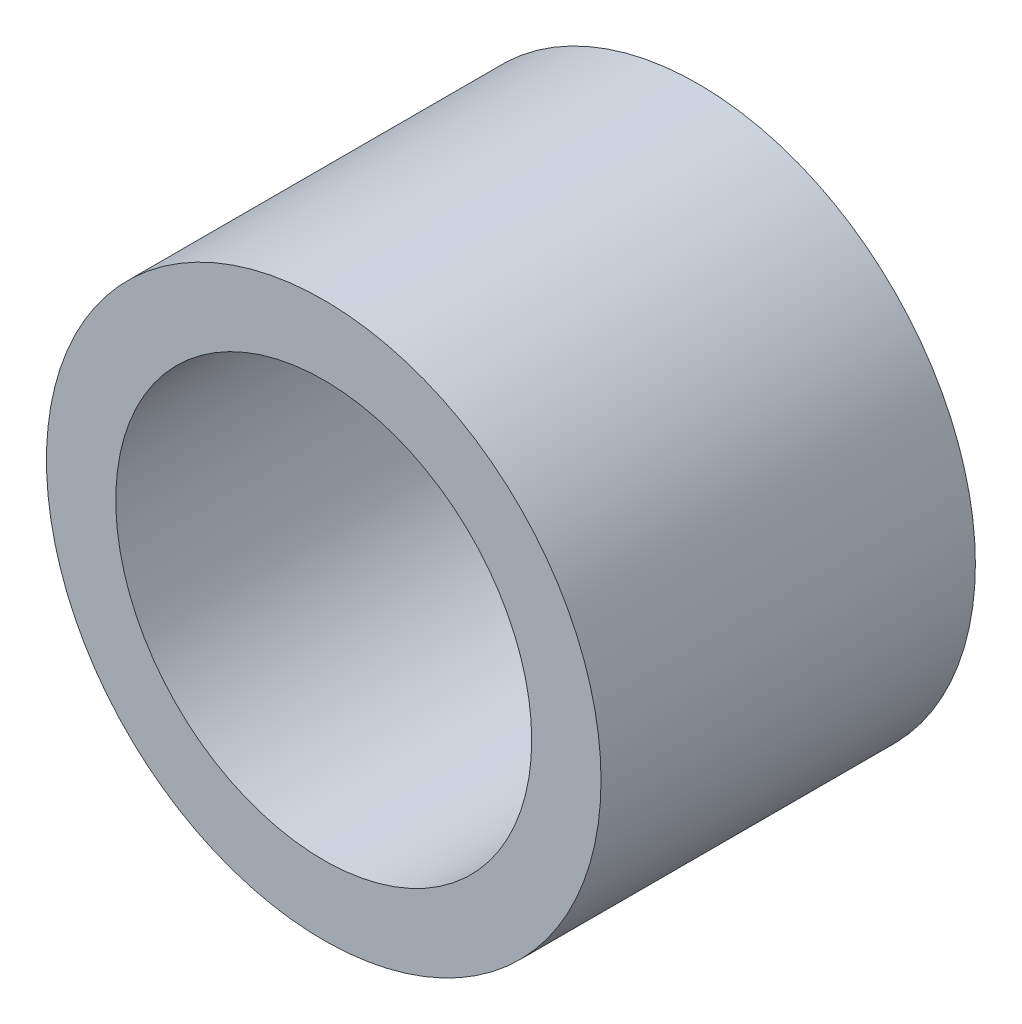
ISO-10303-21;
HEADER;
FILE_DESCRIPTION(('STEP AP214'),'2;1');
FILE_NAME('part.step','',(''),(''),'','','');
FILE_SCHEMA(('AUTOMOTIVE_DESIGN { 1 0 10303 214 1 1 1 1 }'));
ENDSEC;
DATA;
#1=APPLICATION_CONTEXT('core data for automotive mechanical design processes');
#2=APPLICATION_PROTOCOL_DEFINITION('international standard','automotive_design',2000,#1);
#3=PRODUCT_CONTEXT('',#1,'mechanical');
#4=PRODUCT('Part','Part','',(#3));
#5=PRODUCT_RELATED_PRODUCT_CATEGORY('part','',(#4));
#6=PRODUCT_DEFINITION_FORMATION('','',#4);
#7=PRODUCT_DEFINITION_CONTEXT('part definition',#1,'design');
#8=PRODUCT_DEFINITION('design','',#6,#7);
#9=PRODUCT_DEFINITION_SHAPE('','',#8);
#10=(LENGTH_UNIT() NAMED_UNIT(*) SI_UNIT(.MILLI.,.METRE.));
#11=(NAMED_UNIT(*) PLANE_ANGLE_UNIT() SI_UNIT($,.RADIAN.));
#12=(NAMED_UNIT(*) SI_UNIT($,.STERADIAN.) SOLID_ANGLE_UNIT());
#13=UNCERTAINTY_MEASURE_WITH_UNIT(LENGTH_MEASURE(1.E-05),#10,'distance_accuracy_value','');
#14=(GEOMETRIC_REPRESENTATION_CONTEXT(3) GLOBAL_UNCERTAINTY_ASSIGNED_CONTEXT((#13)) GLOBAL_UNIT_ASSIGNED_CONTEXT((#10,
#11,#12)) REPRESENTATION_CONTEXT('',''));
#15=CARTESIAN_POINT('',(0.,0.,0.));
#16=DIRECTION('',(0.,0.,1.));
#17=DIRECTION('',(1.,0.,0.));
#18=AXIS2_PLACEMENT_3D('',#15,#16,#17);
#19=CARTESIAN_POINT('',(0.,9.99999999999973,-13.5));
#20=DIRECTION('',(0.,0.,-1.));
#21=DIRECTION('',(-1.,0.,0.));
#22=AXIS2_PLACEMENT_3D('',#19,#20,#21);
#23=PLANE('',#22);
#24=CARTESIAN_POINT('',(0.,0.,-13.5));
#25=DIRECTION('',(0.,0.,1.));
#26=DIRECTION('',(1.,0.,0.));
#27=AXIS2_PLACEMENT_3D('',#24,#25,#26);
#28=CIRCLE('',#27,7.50000000000015);
#29=CARTESIAN_POINT('',(7.50000000000015,0.,-13.5));
#30=VERTEX_POINT('',#29);
#31=EDGE_CURVE('E10',#30,#30,#28,.T.);
#32=ORIENTED_EDGE('',*,*,#31,.T.);
#33=EDGE_LOOP('',(#32));
#34=FACE_BOUND('',#33,.T.);
#35=CARTESIAN_POINT('',(0.,0.,-13.5));
#36=DIRECTION('',(0.,0.,1.));
#37=DIRECTION('',(1.,0.,0.));
#38=AXIS2_PLACEMENT_3D('',#35,#36,#37);
#39=CIRCLE('',#38,9.99999999999973);
#40=CARTESIAN_POINT('',(9.99999999999973,0.,-13.5));
#41=VERTEX_POINT('',#40);
#42=EDGE_CURVE('E46',#41,#41,#39,.T.);
#43=ORIENTED_EDGE('',*,*,#42,.F.);
#44=EDGE_LOOP('',(#43));
#45=FACE_BOUND('',#44,.T.);
#46=ADVANCED_FACE('F32',(#34,#45),#23,.T.);
#47=CARTESIAN_POINT('',(0.,0.,0.));
#48=DIRECTION('',(0.,0.,1.));
#49=DIRECTION('',(1.,0.,0.));
#50=AXIS2_PLACEMENT_3D('',#47,#48,#49);
#51=CYLINDRICAL_SURFACE('',#50,7.50000000000015);
#52=CARTESIAN_POINT('',(0.,0.,0.));
#53=DIRECTION('',(0.,0.,1.));
#54=DIRECTION('',(1.,0.,0.));
#55=AXIS2_PLACEMENT_3D('',#52,#53,#54);
#56=CIRCLE('',#55,7.50000000000015);
#57=CARTESIAN_POINT('',(7.50000000000015,0.,0.));
#58=VERTEX_POINT('',#57);
#59=EDGE_CURVE('E38',#58,#58,#56,.T.);
#60=ORIENTED_EDGE('',*,*,#59,.T.);
#61=EDGE_LOOP('',(#60));
#62=FACE_BOUND('',#61,.T.);
#63=ORIENTED_EDGE('',*,*,#31,.F.);
#64=EDGE_LOOP('',(#63));
#65=FACE_BOUND('',#64,.T.);
#66=ADVANCED_FACE('F56',(#62,#65),#51,.F.);
#67=CARTESIAN_POINT('',(0.,10.,0.));
#68=DIRECTION('',(0.,0.,-1.));
#69=DIRECTION('',(-1.,0.,0.));
#70=AXIS2_PLACEMENT_3D('',#67,#68,#69);
#71=PLANE('',#70);
#72=ORIENTED_EDGE('',*,*,#59,.F.);
#73=EDGE_LOOP('',(#72));
#74=FACE_BOUND('',#73,.T.);
#75=CARTESIAN_POINT('',(0.,0.,0.));
#76=DIRECTION('',(0.,0.,1.));
#77=DIRECTION('',(1.,0.,0.));
#78=AXIS2_PLACEMENT_3D('',#75,#76,#77);
#79=CIRCLE('',#78,10.);
#80=CARTESIAN_POINT('',(10.,0.,0.));
#81=VERTEX_POINT('',#80);
#82=EDGE_CURVE('E42',#81,#81,#79,.T.);
#83=ORIENTED_EDGE('',*,*,#82,.T.);
#84=EDGE_LOOP('',(#83));
#85=FACE_BOUND('',#84,.T.);
#86=ADVANCED_FACE('F60',(#74,#85),#71,.F.);
#87=CARTESIAN_POINT('',(0.,0.,0.));
#88=DIRECTION('',(0.,0.,1.));
#89=DIRECTION('',(1.,0.,0.));
#90=AXIS2_PLACEMENT_3D('',#87,#88,#89);
#91=CYLINDRICAL_SURFACE('',#90,9.99999999999986);
#92=ORIENTED_EDGE('',*,*,#42,.T.);
#93=EDGE_LOOP('',(#92));
#94=FACE_BOUND('',#93,.T.);
#95=ORIENTED_EDGE('',*,*,#82,.F.);
#96=EDGE_LOOP('',(#95));
#97=FACE_BOUND('',#96,.T.);
#98=ADVANCED_FACE('F52',(#94,#97),#91,.T.);
#99=CLOSED_SHELL('',(#46,#66,#86,#98));
#100=MANIFOLD_SOLID_BREP('B2',#99);
#101=ADVANCED_BREP_SHAPE_REPRESENTATION('',(#18,#100),#14);
#102=SHAPE_DEFINITION_REPRESENTATION(#9,#101);
ENDSEC;
END-ISO-10303-21;
